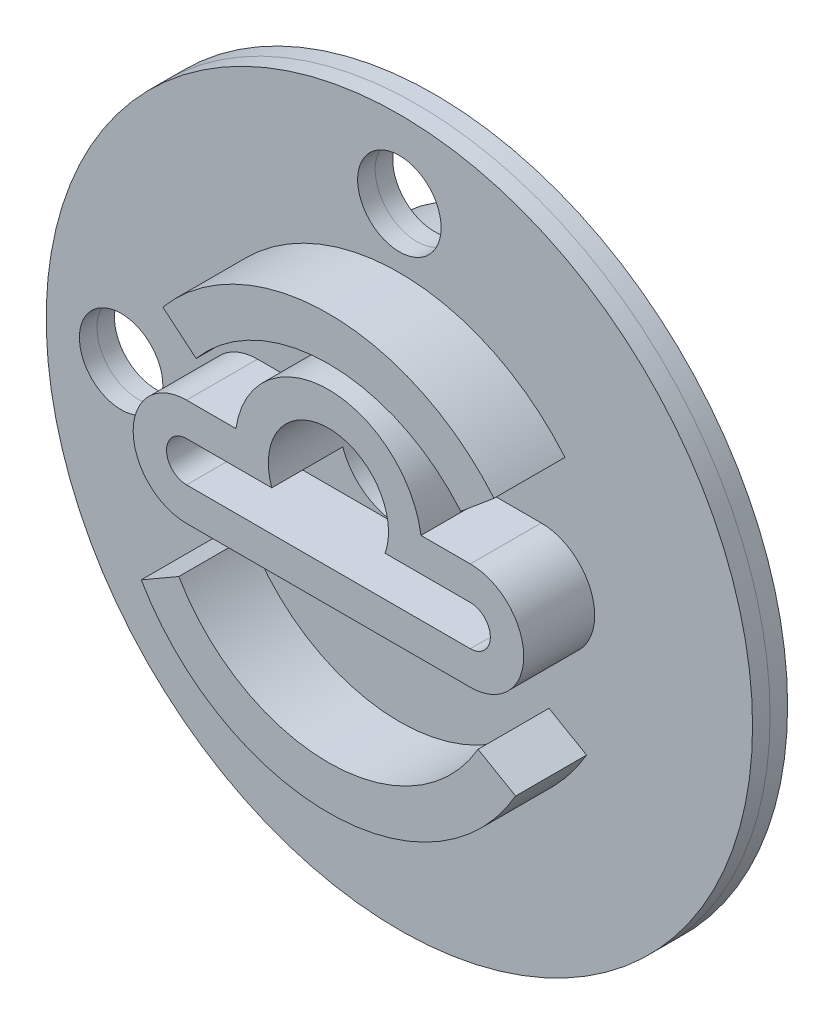
ISO-10303-21;
HEADER;
FILE_DESCRIPTION(('STEP AP214'),'2;1');
FILE_NAME('part.step','',(''),(''),'','','');
FILE_SCHEMA(('AUTOMOTIVE_DESIGN { 1 0 10303 214 1 1 1 1 }'));
ENDSEC;
DATA;
#1=APPLICATION_CONTEXT('core data for automotive mechanical design processes');
#2=APPLICATION_PROTOCOL_DEFINITION('international standard','automotive_design',2000,#1);
#3=PRODUCT_CONTEXT('',#1,'mechanical');
#4=PRODUCT('Part','Part','',(#3));
#5=PRODUCT_RELATED_PRODUCT_CATEGORY('part','',(#4));
#6=PRODUCT_DEFINITION_FORMATION('','',#4);
#7=PRODUCT_DEFINITION_CONTEXT('part definition',#1,'design');
#8=PRODUCT_DEFINITION('design','',#6,#7);
#9=PRODUCT_DEFINITION_SHAPE('','',#8);
#10=(LENGTH_UNIT() NAMED_UNIT(*) SI_UNIT(.MILLI.,.METRE.));
#11=(NAMED_UNIT(*) PLANE_ANGLE_UNIT() SI_UNIT($,.RADIAN.));
#12=(NAMED_UNIT(*) SI_UNIT($,.STERADIAN.) SOLID_ANGLE_UNIT());
#13=UNCERTAINTY_MEASURE_WITH_UNIT(LENGTH_MEASURE(1.E-05),#10,'distance_accuracy_value','');
#14=(GEOMETRIC_REPRESENTATION_CONTEXT(3) GLOBAL_UNCERTAINTY_ASSIGNED_CONTEXT((#13)) GLOBAL_UNIT_ASSIGNED_CONTEXT((#10,
#11,#12)) REPRESENTATION_CONTEXT('',''));
#15=CARTESIAN_POINT('',(0.,0.,0.));
#16=DIRECTION('',(0.,0.,1.));
#17=DIRECTION('',(1.,0.,0.));
#18=AXIS2_PLACEMENT_3D('',#15,#16,#17);
#19=CARTESIAN_POINT('',(-21.17,21.16,1.05));
#20=DIRECTION('',(0.,0.,1.));
#21=DIRECTION('',(1.,0.,0.));
#22=AXIS2_PLACEMENT_3D('',#19,#20,#21);
#23=PLANE('',#22);
#24=CARTESIAN_POINT('',(0.,16.5276106642978,1.05));
#25=DIRECTION('',(0.,0.,1.));
#26=DIRECTION('',(1.,0.,0.));
#27=AXIS2_PLACEMENT_3D('',#24,#25,#26);
#28=CIRCLE('',#27,2.5);
#29=CARTESIAN_POINT('',(2.5,16.5276106642978,1.05));
#30=VERTEX_POINT('',#29);
#31=EDGE_CURVE('E66',#30,#30,#28,.T.);
#32=ORIENTED_EDGE('',*,*,#31,.F.);
#33=EDGE_LOOP('',(#32));
#34=FACE_BOUND('',#33,.T.);
#35=CARTESIAN_POINT('',(-16.6704941141802,0.,1.05));
#36=DIRECTION('',(0.,0.,1.));
#37=DIRECTION('',(1.,0.,0.));
#38=AXIS2_PLACEMENT_3D('',#35,#36,#37);
#39=CIRCLE('',#38,2.5);
#40=CARTESIAN_POINT('',(-14.1704941141802,0.,1.05));
#41=VERTEX_POINT('',#40);
#42=EDGE_CURVE('E69',#41,#41,#39,.T.);
#43=ORIENTED_EDGE('',*,*,#42,.F.);
#44=EDGE_LOOP('',(#43));
#45=FACE_BOUND('',#44,.T.);
#46=CARTESIAN_POINT('',(0.,0.,1.05));
#47=DIRECTION('',(0.,0.,1.));
#48=DIRECTION('',(1.,0.,0.));
#49=AXIS2_PLACEMENT_3D('',#46,#47,#48);
#50=CIRCLE('',#49,21.16);
#51=CARTESIAN_POINT('',(21.16,0.,1.05));
#52=VERTEX_POINT('',#51);
#53=EDGE_CURVE('E60',#52,#52,#50,.T.);
#54=ORIENTED_EDGE('',*,*,#53,.T.);
#55=EDGE_LOOP('',(#54));
#56=FACE_BOUND('',#55,.T.);
#57=CARTESIAN_POINT('',(0.,3.41,1.05));
#58=DIRECTION('',(0.,0.,1.));
#59=DIRECTION('',(1.,0.,0.));
#60=AXIS2_PLACEMENT_3D('',#57,#58,#59);
#61=CIRCLE('',#60,3.6);
#62=CARTESIAN_POINT('',(3.6,3.41,1.05));
#63=VERTEX_POINT('',#62);
#64=EDGE_CURVE('E64',#63,#63,#61,.F.);
#65=ORIENTED_EDGE('',*,*,#64,.T.);
#66=EDGE_LOOP('',(#65));
#67=FACE_BOUND('',#66,.T.);
#68=ADVANCED_FACE('F42',(#34,#45,#56,#67),#23,.T.);
#69=CARTESIAN_POINT('',(0.,0.,2.1));
#70=DIRECTION('',(0.,0.,-1.));
#71=DIRECTION('',(-1.,0.,0.));
#72=AXIS2_PLACEMENT_3D('',#69,#70,#71);
#73=CYLINDRICAL_SURFACE('',#72,21.16);
#74=CARTESIAN_POINT('',(0.,0.,0.));
#75=DIRECTION('',(0.,0.,1.));
#76=DIRECTION('',(1.,0.,0.));
#77=AXIS2_PLACEMENT_3D('',#74,#75,#76);
#78=CIRCLE('',#77,21.16);
#79=CARTESIAN_POINT('',(21.16,0.,0.));
#80=VERTEX_POINT('',#79);
#81=EDGE_CURVE('E85',#80,#80,#78,.T.);
#82=ORIENTED_EDGE('',*,*,#81,.T.);
#83=EDGE_LOOP('',(#82));
#84=FACE_BOUND('',#83,.T.);
#85=ORIENTED_EDGE('',*,*,#53,.F.);
#86=EDGE_LOOP('',(#85));
#87=FACE_BOUND('',#86,.T.);
#88=ADVANCED_FACE('F44',(#84,#87),#73,.T.);
#89=CARTESIAN_POINT('',(0.,3.41,0.));
#90=DIRECTION('',(0.,0.,1.));
#91=DIRECTION('',(1.,0.,0.));
#92=AXIS2_PLACEMENT_3D('',#89,#90,#91);
#93=CYLINDRICAL_SURFACE('',#92,3.6);
#94=CARTESIAN_POINT('',(0.,3.41,-2.2));
#95=DIRECTION('',(0.,0.,-1.));
#96=DIRECTION('',(-1.,0.,0.));
#97=AXIS2_PLACEMENT_3D('',#94,#95,#96);
#98=CIRCLE('',#97,3.6);
#99=CARTESIAN_POINT('',(-3.6,3.41,-2.2));
#100=VERTEX_POINT('',#99);
#101=EDGE_CURVE('E90',#100,#100,#98,.T.);
#102=ORIENTED_EDGE('',*,*,#101,.T.);
#103=EDGE_LOOP('',(#102));
#104=FACE_BOUND('',#103,.T.);
#105=ORIENTED_EDGE('',*,*,#64,.F.);
#106=EDGE_LOOP('',(#105));
#107=FACE_BOUND('',#106,.T.);
#108=ADVANCED_FACE('F118',(#104,#107),#93,.F.);
#109=CARTESIAN_POINT('',(0.,0.,0.));
#110=DIRECTION('',(0.,0.,1.));
#111=DIRECTION('',(1.,0.,0.));
#112=AXIS2_PLACEMENT_3D('',#109,#110,#111);
#113=PLANE('',#112);
#114=CARTESIAN_POINT('',(0.,3.595,0.));
#115=DIRECTION('',(0.,0.,1.));
#116=DIRECTION('',(1.,0.,0.));
#117=AXIS2_PLACEMENT_3D('',#114,#115,#116);
#118=CIRCLE('',#117,4.85);
#119=CARTESIAN_POINT('',(4.85,3.595,0.));
#120=VERTEX_POINT('',#119);
#121=EDGE_CURVE('E82',#120,#120,#118,.F.);
#122=ORIENTED_EDGE('',*,*,#121,.F.);
#123=EDGE_LOOP('',(#122));
#124=FACE_BOUND('',#123,.T.);
#125=CARTESIAN_POINT('',(0.,0.,0.));
#126=DIRECTION('',(0.,0.,-1.));
#127=DIRECTION('',(-1.,0.,0.));
#128=AXIS2_PLACEMENT_3D('',#125,#126,#127);
#129=CIRCLE('',#128,10.);
#130=CARTESIAN_POINT('',(-10.,0.,0.));
#131=VERTEX_POINT('',#130);
#132=EDGE_CURVE('E11',#131,#131,#129,.T.);
#133=ORIENTED_EDGE('',*,*,#132,.T.);
#134=EDGE_LOOP('',(#133));
#135=FACE_BOUND('',#134,.T.);
#136=ADVANCED_FACE('F111',(#124,#135),#113,.F.);
#137=CARTESIAN_POINT('',(0.,16.5276106642978,0.));
#138=DIRECTION('',(0.,0.,1.));
#139=DIRECTION('',(1.,0.,0.));
#140=AXIS2_PLACEMENT_3D('',#137,#138,#139);
#141=CIRCLE('',#140,2.5);
#142=CARTESIAN_POINT('',(2.5,16.5276106642978,0.));
#143=VERTEX_POINT('',#142);
#144=EDGE_CURVE('E46',#143,#143,#141,.T.);
#145=ORIENTED_EDGE('',*,*,#144,.T.);
#146=EDGE_LOOP('',(#145));
#147=FACE_BOUND('',#146,.T.);
#148=CARTESIAN_POINT('',(-16.6704941141802,0.,0.));
#149=DIRECTION('',(0.,0.,1.));
#150=DIRECTION('',(1.,0.,0.));
#151=AXIS2_PLACEMENT_3D('',#148,#149,#150);
#152=CIRCLE('',#151,2.5);
#153=CARTESIAN_POINT('',(-14.1704941141802,0.,0.));
#154=VERTEX_POINT('',#153);
#155=EDGE_CURVE('E67',#154,#154,#152,.T.);
#156=ORIENTED_EDGE('',*,*,#155,.T.);
#157=EDGE_LOOP('',(#156));
#158=FACE_BOUND('',#157,.T.);
#159=CARTESIAN_POINT('',(0.,0.,0.));
#160=DIRECTION('',(0.,0.,1.));
#161=DIRECTION('',(1.,0.,0.));
#162=AXIS2_PLACEMENT_3D('',#159,#160,#161);
#163=CIRCLE('',#162,11.25);
#164=CARTESIAN_POINT('',(11.25,0.,0.));
#165=VERTEX_POINT('',#164);
#166=EDGE_CURVE('E63',#165,#165,#163,.F.);
#167=ORIENTED_EDGE('',*,*,#166,.F.);
#168=EDGE_LOOP('',(#167));
#169=FACE_BOUND('',#168,.T.);
#170=ORIENTED_EDGE('',*,*,#81,.F.);
#171=EDGE_LOOP('',(#170));
#172=FACE_BOUND('',#171,.T.);
#173=ADVANCED_FACE('F107',(#147,#158,#169,#172),#113,.F.);
#174=CARTESIAN_POINT('',(0.,3.595,-2.2));
#175=DIRECTION('',(0.,0.,-1.));
#176=DIRECTION('',(-1.,0.,0.));
#177=AXIS2_PLACEMENT_3D('',#174,#175,#176);
#178=PLANE('',#177);
#179=CARTESIAN_POINT('',(0.,3.595,-2.2));
#180=DIRECTION('',(0.,0.,-1.));
#181=DIRECTION('',(-1.,0.,0.));
#182=AXIS2_PLACEMENT_3D('',#179,#180,#181);
#183=CIRCLE('',#182,4.85);
#184=CARTESIAN_POINT('',(-4.85,3.595,-2.2));
#185=VERTEX_POINT('',#184);
#186=EDGE_CURVE('E88',#185,#185,#183,.T.);
#187=ORIENTED_EDGE('',*,*,#186,.T.);
#188=EDGE_LOOP('',(#187));
#189=FACE_BOUND('',#188,.T.);
#190=ORIENTED_EDGE('',*,*,#101,.F.);
#191=EDGE_LOOP('',(#190));
#192=FACE_BOUND('',#191,.T.);
#193=ADVANCED_FACE('F110',(#189,#192),#178,.T.);
#194=CARTESIAN_POINT('',(0.,3.595,-2.2));
#195=DIRECTION('',(0.,0.,1.));
#196=DIRECTION('',(1.,0.,0.));
#197=AXIS2_PLACEMENT_3D('',#194,#195,#196);
#198=CYLINDRICAL_SURFACE('',#197,4.85);
#199=ORIENTED_EDGE('',*,*,#186,.F.);
#200=EDGE_LOOP('',(#199));
#201=FACE_BOUND('',#200,.T.);
#202=ORIENTED_EDGE('',*,*,#121,.T.);
#203=EDGE_LOOP('',(#202));
#204=FACE_BOUND('',#203,.T.);
#205=ADVANCED_FACE('F138',(#201,#204),#198,.T.);
#206=CARTESIAN_POINT('',(0.,0.,-6.));
#207=DIRECTION('',(0.,0.,-1.));
#208=DIRECTION('',(-1.,0.,0.));
#209=AXIS2_PLACEMENT_3D('',#206,#207,#208);
#210=PLANE('',#209);
#211=CARTESIAN_POINT('',(0.,0.,-6.));
#212=DIRECTION('',(0.,0.,-1.));
#213=DIRECTION('',(-1.,0.,0.));
#214=AXIS2_PLACEMENT_3D('',#211,#212,#213);
#215=CIRCLE('',#214,11.25);
#216=CARTESIAN_POINT('',(-11.25,0.,-6.));
#217=VERTEX_POINT('',#216);
#218=EDGE_CURVE('E55',#217,#217,#215,.T.);
#219=ORIENTED_EDGE('',*,*,#218,.T.);
#220=EDGE_LOOP('',(#219));
#221=FACE_BOUND('',#220,.T.);
#222=CARTESIAN_POINT('',(0.,0.,-6.));
#223=DIRECTION('',(0.,0.,-1.));
#224=DIRECTION('',(-1.,0.,0.));
#225=AXIS2_PLACEMENT_3D('',#222,#223,#224);
#226=CIRCLE('',#225,10.);
#227=CARTESIAN_POINT('',(-10.,0.,-6.));
#228=VERTEX_POINT('',#227);
#229=EDGE_CURVE('E50',#228,#228,#226,.T.);
#230=ORIENTED_EDGE('',*,*,#229,.F.);
#231=EDGE_LOOP('',(#230));
#232=FACE_BOUND('',#231,.T.);
#233=ADVANCED_FACE('F97',(#221,#232),#210,.T.);
#234=CARTESIAN_POINT('',(0.,0.,-6.));
#235=DIRECTION('',(0.,0.,1.));
#236=DIRECTION('',(1.,0.,0.));
#237=AXIS2_PLACEMENT_3D('',#234,#235,#236);
#238=CYLINDRICAL_SURFACE('',#237,11.25);
#239=ORIENTED_EDGE('',*,*,#218,.F.);
#240=EDGE_LOOP('',(#239));
#241=FACE_BOUND('',#240,.T.);
#242=ORIENTED_EDGE('',*,*,#166,.T.);
#243=EDGE_LOOP('',(#242));
#244=FACE_BOUND('',#243,.T.);
#245=ADVANCED_FACE('F100',(#241,#244),#238,.T.);
#246=CARTESIAN_POINT('',(0.,0.,-6.));
#247=DIRECTION('',(0.,0.,1.));
#248=DIRECTION('',(1.,0.,0.));
#249=AXIS2_PLACEMENT_3D('',#246,#247,#248);
#250=CYLINDRICAL_SURFACE('',#249,10.);
#251=ORIENTED_EDGE('',*,*,#229,.T.);
#252=EDGE_LOOP('',(#251));
#253=FACE_BOUND('',#252,.T.);
#254=ORIENTED_EDGE('',*,*,#132,.F.);
#255=EDGE_LOOP('',(#254));
#256=FACE_BOUND('',#255,.T.);
#257=ADVANCED_FACE('F103',(#253,#256),#250,.F.);
#258=CARTESIAN_POINT('',(-16.6704941141802,0.,-6.));
#259=DIRECTION('',(0.,0.,1.));
#260=DIRECTION('',(1.,0.,0.));
#261=AXIS2_PLACEMENT_3D('',#258,#259,#260);
#262=CYLINDRICAL_SURFACE('',#261,2.5);
#263=ORIENTED_EDGE('',*,*,#42,.T.);
#264=EDGE_LOOP('',(#263));
#265=FACE_BOUND('',#264,.T.);
#266=ORIENTED_EDGE('',*,*,#155,.F.);
#267=EDGE_LOOP('',(#266));
#268=FACE_BOUND('',#267,.T.);
#269=ADVANCED_FACE('F125',(#265,#268),#262,.F.);
#270=CARTESIAN_POINT('',(0.,16.5276106642978,-6.));
#271=DIRECTION('',(0.,0.,1.));
#272=DIRECTION('',(1.,0.,0.));
#273=AXIS2_PLACEMENT_3D('',#270,#271,#272);
#274=CYLINDRICAL_SURFACE('',#273,2.5);
#275=ORIENTED_EDGE('',*,*,#31,.T.);
#276=EDGE_LOOP('',(#275));
#277=FACE_BOUND('',#276,.T.);
#278=ORIENTED_EDGE('',*,*,#144,.F.);
#279=EDGE_LOOP('',(#278));
#280=FACE_BOUND('',#279,.T.);
#281=ADVANCED_FACE('F148',(#277,#280),#274,.F.);
#282=CLOSED_SHELL('',(#68,#88,#108,#136,#173,#193,#205,#233,#245,#257,#269,#281));
#283=MANIFOLD_SOLID_BREP('B2',#282);
#284=CARTESIAN_POINT('',(0.,0.,2.1));
#285=DIRECTION('',(0.,0.,1.));
#286=DIRECTION('',(1.,0.,0.));
#287=AXIS2_PLACEMENT_3D('',#284,#285,#286);
#288=PLANE('',#287);
#289=CARTESIAN_POINT('',(0.,16.5276106642978,2.1));
#290=DIRECTION('',(0.,0.,1.));
#291=DIRECTION('',(1.,0.,0.));
#292=AXIS2_PLACEMENT_3D('',#289,#290,#291);
#293=CIRCLE('',#292,2.5);
#294=CARTESIAN_POINT('',(2.5,16.5276106642978,2.1));
#295=VERTEX_POINT('',#294);
#296=EDGE_CURVE('E538',#295,#295,#293,.T.);
#297=ORIENTED_EDGE('',*,*,#296,.F.);
#298=EDGE_LOOP('',(#297));
#299=FACE_BOUND('',#298,.T.);
#300=CARTESIAN_POINT('',(-16.6704941141802,0.,2.1));
#301=DIRECTION('',(0.,0.,1.));
#302=DIRECTION('',(1.,0.,0.));
#303=AXIS2_PLACEMENT_3D('',#300,#301,#302);
#304=CIRCLE('',#303,2.5);
#305=CARTESIAN_POINT('',(-14.1704941141802,0.,2.1));
#306=VERTEX_POINT('',#305);
#307=EDGE_CURVE('E543',#306,#306,#304,.T.);
#308=ORIENTED_EDGE('',*,*,#307,.F.);
#309=EDGE_LOOP('',(#308));
#310=FACE_BOUND('',#309,.T.);
#311=CARTESIAN_POINT('',(-8.49999999999999,1.01,2.1));
#312=DIRECTION('',(0.,0.,1.));
#313=DIRECTION('',(1.,0.,0.));
#314=AXIS2_PLACEMENT_3D('',#311,#312,#313);
#315=CIRCLE('',#314,3.2);
#316=CARTESIAN_POINT('',(-8.49999999999999,4.21,2.1));
#317=VERTEX_POINT('',#316);
#318=CARTESIAN_POINT('',(-8.49999999999999,-2.19,2.1));
#319=VERTEX_POINT('',#318);
#320=EDGE_CURVE('E476',#317,#319,#315,.T.);
#321=ORIENTED_EDGE('',*,*,#320,.F.);
#322=DIRECTION('',(-1.,0.,0.));
#323=VECTOR('',#322,1.);
#324=CARTESIAN_POINT('',(-8.49999999999999,4.21,2.1));
#325=LINE('',#324,#323);
#326=CARTESIAN_POINT('',(-5.5425625842204,4.21,2.1));
#327=VERTEX_POINT('',#326);
#328=EDGE_CURVE('E481',#327,#317,#325,.T.);
#329=ORIENTED_EDGE('',*,*,#328,.F.);
#330=CARTESIAN_POINT('',(0.,3.41,2.1));
#331=DIRECTION('',(0.,0.,1.));
#332=DIRECTION('',(1.,0.,0.));
#333=AXIS2_PLACEMENT_3D('',#330,#331,#332);
#334=CIRCLE('',#333,5.6);
#335=CARTESIAN_POINT('',(5.5425625842204,4.21000000000009,2.1));
#336=VERTEX_POINT('',#335);
#337=EDGE_CURVE('E503',#336,#327,#334,.T.);
#338=ORIENTED_EDGE('',*,*,#337,.F.);
#339=DIRECTION('',(-1.,0.,0.));
#340=VECTOR('',#339,1.);
#341=CARTESIAN_POINT('',(5.5425625842204,4.21000000000009,2.1));
#342=LINE('',#341,#340);
#343=CARTESIAN_POINT('',(8.5,4.21,2.1));
#344=VERTEX_POINT('',#343);
#345=EDGE_CURVE('E500',#344,#336,#342,.T.);
#346=ORIENTED_EDGE('',*,*,#345,.F.);
#347=CARTESIAN_POINT('',(8.5,1.01,2.1));
#348=DIRECTION('',(0.,0.,1.));
#349=DIRECTION('',(1.,0.,0.));
#350=AXIS2_PLACEMENT_3D('',#347,#348,#349);
#351=CIRCLE('',#350,3.2);
#352=CARTESIAN_POINT('',(8.5,-2.19,2.1));
#353=VERTEX_POINT('',#352);
#354=EDGE_CURVE('E497',#353,#344,#351,.T.);
#355=ORIENTED_EDGE('',*,*,#354,.F.);
#356=DIRECTION('',(1.,0.,0.));
#357=VECTOR('',#356,1.);
#358=CARTESIAN_POINT('',(-8.49999999999999,-2.19,2.1));
#359=LINE('',#358,#357);
#360=EDGE_CURVE('E494',#319,#353,#359,.T.);
#361=ORIENTED_EDGE('',*,*,#360,.F.);
#362=EDGE_LOOP('',(#321,#329,#338,#346,#355,#361));
#363=FACE_BOUND('',#362,.T.);
#364=CARTESIAN_POINT('',(0.,0.,2.1));
#365=DIRECTION('',(0.,0.,1.));
#366=DIRECTION('',(1.,0.,0.));
#367=AXIS2_PLACEMENT_3D('',#364,#365,#366);
#368=CIRCLE('',#367,21.16);
#369=CARTESIAN_POINT('',(21.16,0.,2.1));
#370=VERTEX_POINT('',#369);
#371=EDGE_CURVE('E529',#370,#370,#368,.T.);
#372=ORIENTED_EDGE('',*,*,#371,.T.);
#373=EDGE_LOOP('',(#372));
#374=FACE_BOUND('',#373,.T.);
#375=DIRECTION('',(-0.866025403784436,-0.500000000000004,0.));
#376=VECTOR('',#375,1.);
#377=CARTESIAN_POINT('',(-8.96336292916891,-5.17500000000004,2.1));
#378=LINE('',#377,#376);
#379=CARTESIAN_POINT('',(-8.96336292916891,-5.17500000000004,2.1));
#380=VERTEX_POINT('',#379);
#381=CARTESIAN_POINT('',(-11.2150289790085,-6.47500000000005,2.1));
#382=VERTEX_POINT('',#381);
#383=EDGE_CURVE('E409',#380,#382,#378,.T.);
#384=ORIENTED_EDGE('',*,*,#383,.F.);
#385=CARTESIAN_POINT('',(0.,0.,2.1));
#386=DIRECTION('',(0.,0.,-1.));
#387=DIRECTION('',(1.,0.,0.));
#388=AXIS2_PLACEMENT_3D('',#385,#386,#387);
#389=CIRCLE('',#388,10.35);
#390=CARTESIAN_POINT('',(8.96336292916899,-5.17499999999991,2.1));
#391=VERTEX_POINT('',#390);
#392=EDGE_CURVE('E406',#391,#380,#389,.T.);
#393=ORIENTED_EDGE('',*,*,#392,.F.);
#394=DIRECTION('',(-0.866025403784444,0.499999999999992,0.));
#395=VECTOR('',#394,1.);
#396=CARTESIAN_POINT('',(8.96336292916899,-5.17499999999991,2.1));
#397=LINE('',#396,#395);
#398=CARTESIAN_POINT('',(11.2150289790085,-6.47499999999989,2.1));
#399=VERTEX_POINT('',#398);
#400=EDGE_CURVE('E418',#399,#391,#397,.T.);
#401=ORIENTED_EDGE('',*,*,#400,.F.);
#402=CARTESIAN_POINT('',(0.,0.,2.1));
#403=DIRECTION('',(0.,0.,1.));
#404=DIRECTION('',(1.,0.,0.));
#405=AXIS2_PLACEMENT_3D('',#402,#403,#404);
#406=CIRCLE('',#405,12.95);
#407=EDGE_CURVE('E426',#382,#399,#406,.T.);
#408=ORIENTED_EDGE('',*,*,#407,.F.);
#409=EDGE_LOOP('',(#384,#393,#401,#408));
#410=FACE_BOUND('',#409,.T.);
#411=DIRECTION('',(0.766044443118979,0.642787609686538,0.));
#412=VECTOR('',#411,1.);
#413=CARTESIAN_POINT('',(7.92855998628144,6.65285176025567,2.1));
#414=LINE('',#413,#412);
#415=CARTESIAN_POINT('',(7.92855998628144,6.65285176025567,2.1));
#416=VERTEX_POINT('',#415);
#417=CARTESIAN_POINT('',(9.92027553839078,8.32409954544067,2.1));
#418=VERTEX_POINT('',#417);
#419=EDGE_CURVE('E554',#416,#418,#414,.T.);
#420=ORIENTED_EDGE('',*,*,#419,.F.);
#421=CARTESIAN_POINT('',(0.,0.,2.1));
#422=DIRECTION('',(0.,0.,-1.));
#423=DIRECTION('',(1.,0.,0.));
#424=AXIS2_PLACEMENT_3D('',#421,#422,#423);
#425=CIRCLE('',#424,10.35);
#426=CARTESIAN_POINT('',(-7.92855998628143,6.65285176025567,2.1));
#427=VERTEX_POINT('',#426);
#428=EDGE_CURVE('E404',#427,#416,#425,.T.);
#429=ORIENTED_EDGE('',*,*,#428,.F.);
#430=DIRECTION('',(0.766044443118979,-0.642787609686538,0.));
#431=VECTOR('',#430,1.);
#432=CARTESIAN_POINT('',(-7.92855998628143,6.65285176025567,2.1));
#433=LINE('',#432,#431);
#434=CARTESIAN_POINT('',(-9.92027553839078,8.32409954544067,2.1));
#435=VERTEX_POINT('',#434);
#436=EDGE_CURVE('E400',#435,#427,#433,.T.);
#437=ORIENTED_EDGE('',*,*,#436,.F.);
#438=CARTESIAN_POINT('',(0.,0.,2.1));
#439=DIRECTION('',(0.,0.,1.));
#440=DIRECTION('',(1.,0.,0.));
#441=AXIS2_PLACEMENT_3D('',#438,#439,#440);
#442=CIRCLE('',#441,12.95);
#443=EDGE_CURVE('E556',#418,#435,#442,.T.);
#444=ORIENTED_EDGE('',*,*,#443,.F.);
#445=EDGE_LOOP('',(#420,#429,#437,#444));
#446=FACE_BOUND('',#445,.T.);
#447=ADVANCED_FACE('F237',(#299,#310,#363,#374,#410,#446),#288,.T.);
#448=CARTESIAN_POINT('',(8.5,1.01,2.1));
#449=DIRECTION('',(0.,0.,1.));
#450=DIRECTION('',(1.,0.,0.));
#451=AXIS2_PLACEMENT_3D('',#448,#449,#450);
#452=CIRCLE('',#451,1.2);
#453=CARTESIAN_POINT('',(8.5,-0.189999999999997,2.1));
#454=VERTEX_POINT('',#453);
#455=CARTESIAN_POINT('',(8.5,2.21,2.1));
#456=VERTEX_POINT('',#455);
#457=EDGE_CURVE('E456',#454,#456,#452,.T.);
#458=ORIENTED_EDGE('',*,*,#457,.T.);
#459=DIRECTION('',(-1.,0.,0.));
#460=VECTOR('',#459,1.);
#461=CARTESIAN_POINT('',(3.39411254969543,2.21,2.1));
#462=LINE('',#461,#460);
#463=CARTESIAN_POINT('',(3.39411254969543,2.21,2.1));
#464=VERTEX_POINT('',#463);
#465=EDGE_CURVE('E459',#456,#464,#462,.T.);
#466=ORIENTED_EDGE('',*,*,#465,.T.);
#467=CARTESIAN_POINT('',(0.,3.41,2.1));
#468=DIRECTION('',(0.,0.,1.));
#469=DIRECTION('',(1.,0.,0.));
#470=AXIS2_PLACEMENT_3D('',#467,#468,#469);
#471=CIRCLE('',#470,3.6);
#472=CARTESIAN_POINT('',(0.,-0.189999999999998,2.1));
#473=VERTEX_POINT('',#472);
#474=EDGE_CURVE('E525',#473,#464,#471,.T.);
#475=ORIENTED_EDGE('',*,*,#474,.F.);
#476=DIRECTION('',(1.,0.,0.));
#477=VECTOR('',#476,1.);
#478=CARTESIAN_POINT('',(-8.49999999999999,-0.189999999999999,2.1));
#479=LINE('',#478,#477);
#480=EDGE_CURVE('E40',#473,#454,#479,.T.);
#481=ORIENTED_EDGE('',*,*,#480,.T.);
#482=EDGE_LOOP('',(#458,#466,#475,#481));
#483=FACE_BOUND('',#482,.T.);
#484=ADVANCED_FACE('F575',(#483),#288,.T.);
#485=CARTESIAN_POINT('',(-8.49999999999999,1.01,2.1));
#486=DIRECTION('',(0.,0.,1.));
#487=DIRECTION('',(1.,0.,0.));
#488=AXIS2_PLACEMENT_3D('',#485,#486,#487);
#489=CIRCLE('',#488,1.2);
#490=CARTESIAN_POINT('',(-8.49999999999999,2.21,2.1));
#491=VERTEX_POINT('',#490);
#492=CARTESIAN_POINT('',(-8.49999999999999,-0.189999999999999,2.1));
#493=VERTEX_POINT('',#492);
#494=EDGE_CURVE('E437',#491,#493,#489,.T.);
#495=ORIENTED_EDGE('',*,*,#494,.T.);
#496=EDGE_CURVE('E248',#493,#473,#479,.T.);
#497=ORIENTED_EDGE('',*,*,#496,.T.);
#498=CARTESIAN_POINT('',(-3.39411254969543,2.21,2.1));
#499=VERTEX_POINT('',#498);
#500=EDGE_CURVE('E526',#499,#473,#471,.T.);
#501=ORIENTED_EDGE('',*,*,#500,.F.);
#502=DIRECTION('',(-1.,0.,0.));
#503=VECTOR('',#502,1.);
#504=CARTESIAN_POINT('',(-8.49999999999999,2.21,2.1));
#505=LINE('',#504,#503);
#506=EDGE_CURVE('E441',#499,#491,#505,.T.);
#507=ORIENTED_EDGE('',*,*,#506,.T.);
#508=EDGE_LOOP('',(#495,#497,#501,#507));
#509=FACE_BOUND('',#508,.T.);
#510=ADVANCED_FACE('F578',(#509),#288,.T.);
#511=CARTESIAN_POINT('',(-21.17,21.16,1.05));
#512=DIRECTION('',(0.,0.,1.));
#513=DIRECTION('',(1.,0.,0.));
#514=AXIS2_PLACEMENT_3D('',#511,#512,#513);
#515=PLANE('',#514);
#516=CARTESIAN_POINT('',(0.,16.5276106642978,1.05));
#517=DIRECTION('',(0.,0.,1.));
#518=DIRECTION('',(1.,0.,0.));
#519=AXIS2_PLACEMENT_3D('',#516,#517,#518);
#520=CIRCLE('',#519,2.5);
#521=CARTESIAN_POINT('',(2.5,16.5276106642978,1.05));
#522=VERTEX_POINT('',#521);
#523=EDGE_CURVE('E241',#522,#522,#520,.T.);
#524=ORIENTED_EDGE('',*,*,#523,.T.);
#525=EDGE_LOOP('',(#524));
#526=FACE_BOUND('',#525,.T.);
#527=CARTESIAN_POINT('',(-16.6704941141802,0.,1.05));
#528=DIRECTION('',(0.,0.,1.));
#529=DIRECTION('',(1.,0.,0.));
#530=AXIS2_PLACEMENT_3D('',#527,#528,#529);
#531=CIRCLE('',#530,2.5);
#532=CARTESIAN_POINT('',(-14.1704941141802,0.,1.05));
#533=VERTEX_POINT('',#532);
#534=EDGE_CURVE('E536',#533,#533,#531,.T.);
#535=ORIENTED_EDGE('',*,*,#534,.T.);
#536=EDGE_LOOP('',(#535));
#537=FACE_BOUND('',#536,.T.);
#538=CARTESIAN_POINT('',(0.,3.41,1.05));
#539=DIRECTION('',(0.,0.,1.));
#540=DIRECTION('',(1.,0.,0.));
#541=AXIS2_PLACEMENT_3D('',#538,#539,#540);
#542=CIRCLE('',#541,3.6);
#543=CARTESIAN_POINT('',(3.6,3.41,1.05));
#544=VERTEX_POINT('',#543);
#545=EDGE_CURVE('E532',#544,#544,#542,.F.);
#546=ORIENTED_EDGE('',*,*,#545,.F.);
#547=EDGE_LOOP('',(#546));
#548=FACE_BOUND('',#547,.T.);
#549=CARTESIAN_POINT('',(0.,0.,1.05));
#550=DIRECTION('',(0.,0.,1.));
#551=DIRECTION('',(1.,0.,0.));
#552=AXIS2_PLACEMENT_3D('',#549,#550,#551);
#553=CIRCLE('',#552,21.16);
#554=CARTESIAN_POINT('',(21.16,0.,1.05));
#555=VERTEX_POINT('',#554);
#556=EDGE_CURVE('E246',#555,#555,#553,.T.);
#557=ORIENTED_EDGE('',*,*,#556,.F.);
#558=EDGE_LOOP('',(#557));
#559=FACE_BOUND('',#558,.T.);
#560=ADVANCED_FACE('F239',(#526,#537,#548,#559),#515,.F.);
#561=CARTESIAN_POINT('',(0.,3.41,0.));
#562=DIRECTION('',(0.,0.,1.));
#563=DIRECTION('',(1.,0.,0.));
#564=AXIS2_PLACEMENT_3D('',#561,#562,#563);
#565=CYLINDRICAL_SURFACE('',#564,3.6);
#566=ORIENTED_EDGE('',*,*,#545,.T.);
#567=EDGE_LOOP('',(#566));
#568=FACE_BOUND('',#567,.T.);
#569=ORIENTED_EDGE('',*,*,#500,.T.);
#570=ORIENTED_EDGE('',*,*,#474,.T.);
#571=DIRECTION('',(0.,0.,-1.));
#572=VECTOR('',#571,1.);
#573=CARTESIAN_POINT('',(3.39411254969543,2.21,6.35));
#574=LINE('',#573,#572);
#575=CARTESIAN_POINT('',(3.39411254969543,2.21,6.35));
#576=VERTEX_POINT('',#575);
#577=EDGE_CURVE('E467',#576,#464,#574,.T.);
#578=ORIENTED_EDGE('',*,*,#577,.F.);
#579=CARTESIAN_POINT('',(0.,3.41,6.35));
#580=DIRECTION('',(0.,0.,1.));
#581=DIRECTION('',(1.,0.,0.));
#582=AXIS2_PLACEMENT_3D('',#579,#580,#581);
#583=CIRCLE('',#582,3.6);
#584=CARTESIAN_POINT('',(-3.39411254969543,2.21,6.35));
#585=VERTEX_POINT('',#584);
#586=EDGE_CURVE('E447',#576,#585,#583,.T.);
#587=ORIENTED_EDGE('',*,*,#586,.T.);
#588=DIRECTION('',(0.,0.,-1.));
#589=VECTOR('',#588,1.);
#590=CARTESIAN_POINT('',(-3.39411254969543,2.21,6.35));
#591=LINE('',#590,#589);
#592=EDGE_CURVE('E465',#585,#499,#591,.T.);
#593=ORIENTED_EDGE('',*,*,#592,.T.);
#594=EDGE_LOOP('',(#569,#570,#578,#587,#593));
#595=FACE_BOUND('',#594,.T.);
#596=ADVANCED_FACE('F590',(#568,#595),#565,.F.);
#597=CARTESIAN_POINT('',(0.,0.,2.1));
#598=DIRECTION('',(0.,0.,-1.));
#599=DIRECTION('',(-1.,0.,0.));
#600=AXIS2_PLACEMENT_3D('',#597,#598,#599);
#601=CYLINDRICAL_SURFACE('',#600,21.16);
#602=ORIENTED_EDGE('',*,*,#556,.T.);
#603=EDGE_LOOP('',(#602));
#604=FACE_BOUND('',#603,.T.);
#605=ORIENTED_EDGE('',*,*,#371,.F.);
#606=EDGE_LOOP('',(#605));
#607=FACE_BOUND('',#606,.T.);
#608=ADVANCED_FACE('F592',(#604,#607),#601,.T.);
#609=CARTESIAN_POINT('',(-8.49999999999999,1.01,6.35));
#610=DIRECTION('',(0.,0.,1.));
#611=DIRECTION('',(1.,0.,0.));
#612=AXIS2_PLACEMENT_3D('',#609,#610,#611);
#613=PLANE('',#612);
#614=CARTESIAN_POINT('',(-8.49999999999999,1.01,6.35));
#615=DIRECTION('',(0.,0.,1.));
#616=DIRECTION('',(1.,0.,0.));
#617=AXIS2_PLACEMENT_3D('',#614,#615,#616);
#618=CIRCLE('',#617,3.2);
#619=CARTESIAN_POINT('',(-8.49999999999999,4.21,6.35));
#620=VERTEX_POINT('',#619);
#621=CARTESIAN_POINT('',(-8.49999999999999,-2.19,6.35));
#622=VERTEX_POINT('',#621);
#623=EDGE_CURVE('E477',#620,#622,#618,.T.);
#624=ORIENTED_EDGE('',*,*,#623,.T.);
#625=DIRECTION('',(1.,0.,0.));
#626=VECTOR('',#625,1.);
#627=CARTESIAN_POINT('',(-8.49999999999999,-2.19,6.35));
#628=LINE('',#627,#626);
#629=CARTESIAN_POINT('',(8.5,-2.19,6.35));
#630=VERTEX_POINT('',#629);
#631=EDGE_CURVE('E480',#622,#630,#628,.T.);
#632=ORIENTED_EDGE('',*,*,#631,.T.);
#633=CARTESIAN_POINT('',(8.5,1.01,6.35));
#634=DIRECTION('',(0.,0.,1.));
#635=DIRECTION('',(1.,0.,0.));
#636=AXIS2_PLACEMENT_3D('',#633,#634,#635);
#637=CIRCLE('',#636,3.2);
#638=CARTESIAN_POINT('',(8.5,4.21,6.35));
#639=VERTEX_POINT('',#638);
#640=EDGE_CURVE('E483',#630,#639,#637,.T.);
#641=ORIENTED_EDGE('',*,*,#640,.T.);
#642=DIRECTION('',(-1.,0.,0.));
#643=VECTOR('',#642,1.);
#644=CARTESIAN_POINT('',(5.5425625842204,4.21000000000009,6.35));
#645=LINE('',#644,#643);
#646=CARTESIAN_POINT('',(5.5425625842204,4.21000000000009,6.35));
#647=VERTEX_POINT('',#646);
#648=EDGE_CURVE('E485',#639,#647,#645,.T.);
#649=ORIENTED_EDGE('',*,*,#648,.T.);
#650=CARTESIAN_POINT('',(0.,3.41,6.35));
#651=DIRECTION('',(0.,0.,1.));
#652=DIRECTION('',(1.,0.,0.));
#653=AXIS2_PLACEMENT_3D('',#650,#651,#652);
#654=CIRCLE('',#653,5.6);
#655=CARTESIAN_POINT('',(-5.5425625842204,4.21,6.35));
#656=VERTEX_POINT('',#655);
#657=EDGE_CURVE('E487',#647,#656,#654,.T.);
#658=ORIENTED_EDGE('',*,*,#657,.T.);
#659=DIRECTION('',(-1.,0.,0.));
#660=VECTOR('',#659,1.);
#661=CARTESIAN_POINT('',(-8.49999999999999,4.21,6.35));
#662=LINE('',#661,#660);
#663=EDGE_CURVE('E489',#656,#620,#662,.T.);
#664=ORIENTED_EDGE('',*,*,#663,.T.);
#665=EDGE_LOOP('',(#624,#632,#641,#649,#658,#664));
#666=FACE_BOUND('',#665,.T.);
#667=DIRECTION('',(1.,0.,0.));
#668=VECTOR('',#667,1.);
#669=CARTESIAN_POINT('',(-8.49999999999999,-0.189999999999999,6.35));
#670=LINE('',#669,#668);
#671=CARTESIAN_POINT('',(-8.49999999999999,-0.189999999999999,6.35));
#672=VERTEX_POINT('',#671);
#673=CARTESIAN_POINT('',(8.5,-0.189999999999997,6.35));
#674=VERTEX_POINT('',#673);
#675=EDGE_CURVE('E440',#672,#674,#670,.T.);
#676=ORIENTED_EDGE('',*,*,#675,.F.);
#677=CARTESIAN_POINT('',(-8.49999999999999,1.01,6.35));
#678=DIRECTION('',(0.,0.,1.));
#679=DIRECTION('',(1.,0.,0.));
#680=AXIS2_PLACEMENT_3D('',#677,#678,#679);
#681=CIRCLE('',#680,1.2);
#682=CARTESIAN_POINT('',(-8.49999999999999,2.21,6.35));
#683=VERTEX_POINT('',#682);
#684=EDGE_CURVE('E438',#683,#672,#681,.T.);
#685=ORIENTED_EDGE('',*,*,#684,.F.);
#686=DIRECTION('',(-1.,0.,0.));
#687=VECTOR('',#686,1.);
#688=CARTESIAN_POINT('',(-8.49999999999999,2.21,6.35));
#689=LINE('',#688,#687);
#690=EDGE_CURVE('E450',#585,#683,#689,.T.);
#691=ORIENTED_EDGE('',*,*,#690,.F.);
#692=ORIENTED_EDGE('',*,*,#586,.F.);
#693=DIRECTION('',(-1.,0.,0.));
#694=VECTOR('',#693,1.);
#695=CARTESIAN_POINT('',(3.39411254969543,2.21,6.35));
#696=LINE('',#695,#694);
#697=CARTESIAN_POINT('',(8.5,2.21,6.35));
#698=VERTEX_POINT('',#697);
#699=EDGE_CURVE('E445',#698,#576,#696,.T.);
#700=ORIENTED_EDGE('',*,*,#699,.F.);
#701=CARTESIAN_POINT('',(8.5,1.01,6.35));
#702=DIRECTION('',(0.,0.,1.));
#703=DIRECTION('',(1.,0.,0.));
#704=AXIS2_PLACEMENT_3D('',#701,#702,#703);
#705=CIRCLE('',#704,1.2);
#706=EDGE_CURVE('E443',#674,#698,#705,.T.);
#707=ORIENTED_EDGE('',*,*,#706,.F.);
#708=EDGE_LOOP('',(#676,#685,#691,#692,#700,#707));
#709=FACE_BOUND('',#708,.T.);
#710=ADVANCED_FACE('F608',(#666,#709),#613,.T.);
#711=CARTESIAN_POINT('',(-8.49999999999999,1.01,6.35));
#712=DIRECTION('',(0.,0.,-1.));
#713=DIRECTION('',(-1.,0.,0.));
#714=AXIS2_PLACEMENT_3D('',#711,#712,#713);
#715=CYLINDRICAL_SURFACE('',#714,3.2);
#716=ORIENTED_EDGE('',*,*,#320,.T.);
#717=DIRECTION('',(0.,0.,-1.));
#718=VECTOR('',#717,1.);
#719=CARTESIAN_POINT('',(-8.49999999999999,-2.19,6.35));
#720=LINE('',#719,#718);
#721=EDGE_CURVE('E522',#622,#319,#720,.T.);
#722=ORIENTED_EDGE('',*,*,#721,.F.);
#723=ORIENTED_EDGE('',*,*,#623,.F.);
#724=DIRECTION('',(0.,0.,-1.));
#725=VECTOR('',#724,1.);
#726=CARTESIAN_POINT('',(-8.49999999999999,4.21,6.35));
#727=LINE('',#726,#725);
#728=EDGE_CURVE('E491',#620,#317,#727,.T.);
#729=ORIENTED_EDGE('',*,*,#728,.T.);
#730=EDGE_LOOP('',(#716,#722,#723,#729));
#731=FACE_BOUND('',#730,.T.);
#732=ADVANCED_FACE('F646',(#731),#715,.T.);
#733=CARTESIAN_POINT('',(-8.49999999999999,-2.19,6.35));
#734=DIRECTION('',(0.,1.,0.));
#735=DIRECTION('',(-1.,0.,0.));
#736=AXIS2_PLACEMENT_3D('',#733,#734,#735);
#737=PLANE('',#736);
#738=ORIENTED_EDGE('',*,*,#360,.T.);
#739=DIRECTION('',(0.,0.,-1.));
#740=VECTOR('',#739,1.);
#741=CARTESIAN_POINT('',(8.5,-2.19,6.35));
#742=LINE('',#741,#740);
#743=EDGE_CURVE('E519',#630,#353,#742,.T.);
#744=ORIENTED_EDGE('',*,*,#743,.F.);
#745=ORIENTED_EDGE('',*,*,#631,.F.);
#746=ORIENTED_EDGE('',*,*,#721,.T.);
#747=EDGE_LOOP('',(#738,#744,#745,#746));
#748=FACE_BOUND('',#747,.T.);
#749=ADVANCED_FACE('F662',(#748),#737,.F.);
#750=CARTESIAN_POINT('',(8.5,1.01,6.35));
#751=DIRECTION('',(0.,0.,-1.));
#752=DIRECTION('',(-1.,0.,0.));
#753=AXIS2_PLACEMENT_3D('',#750,#751,#752);
#754=CYLINDRICAL_SURFACE('',#753,3.2);
#755=ORIENTED_EDGE('',*,*,#354,.T.);
#756=DIRECTION('',(0.,0.,-1.));
#757=VECTOR('',#756,1.);
#758=CARTESIAN_POINT('',(8.5,4.21,6.35));
#759=LINE('',#758,#757);
#760=EDGE_CURVE('E516',#639,#344,#759,.T.);
#761=ORIENTED_EDGE('',*,*,#760,.F.);
#762=ORIENTED_EDGE('',*,*,#640,.F.);
#763=ORIENTED_EDGE('',*,*,#743,.T.);
#764=EDGE_LOOP('',(#755,#761,#762,#763));
#765=FACE_BOUND('',#764,.T.);
#766=ADVANCED_FACE('F658',(#765),#754,.T.);
#767=CARTESIAN_POINT('',(5.5425625842204,4.21000000000009,6.35));
#768=DIRECTION('',(0.,-1.,0.));
#769=DIRECTION('',(1.,0.,0.));
#770=AXIS2_PLACEMENT_3D('',#767,#768,#769);
#771=PLANE('',#770);
#772=ORIENTED_EDGE('',*,*,#345,.T.);
#773=DIRECTION('',(0.,0.,-1.));
#774=VECTOR('',#773,1.);
#775=CARTESIAN_POINT('',(5.5425625842204,4.21000000000009,6.35));
#776=LINE('',#775,#774);
#777=EDGE_CURVE('E513',#647,#336,#776,.T.);
#778=ORIENTED_EDGE('',*,*,#777,.F.);
#779=ORIENTED_EDGE('',*,*,#648,.F.);
#780=ORIENTED_EDGE('',*,*,#760,.T.);
#781=EDGE_LOOP('',(#772,#778,#779,#780));
#782=FACE_BOUND('',#781,.T.);
#783=ADVANCED_FACE('F654',(#782),#771,.F.);
#784=CARTESIAN_POINT('',(0.,3.41,6.35));
#785=DIRECTION('',(0.,0.,-1.));
#786=DIRECTION('',(-1.,0.,0.));
#787=AXIS2_PLACEMENT_3D('',#784,#785,#786);
#788=CYLINDRICAL_SURFACE('',#787,5.6);
#789=ORIENTED_EDGE('',*,*,#337,.T.);
#790=DIRECTION('',(0.,0.,-1.));
#791=VECTOR('',#790,1.);
#792=CARTESIAN_POINT('',(-5.5425625842204,4.21,6.35));
#793=LINE('',#792,#791);
#794=EDGE_CURVE('E510',#656,#327,#793,.T.);
#795=ORIENTED_EDGE('',*,*,#794,.F.);
#796=ORIENTED_EDGE('',*,*,#657,.F.);
#797=ORIENTED_EDGE('',*,*,#777,.T.);
#798=EDGE_LOOP('',(#789,#795,#796,#797));
#799=FACE_BOUND('',#798,.T.);
#800=ADVANCED_FACE('F650',(#799),#788,.T.);
#801=CARTESIAN_POINT('',(-8.49999999999999,4.21,6.35));
#802=DIRECTION('',(0.,-1.,0.));
#803=DIRECTION('',(1.,0.,0.));
#804=AXIS2_PLACEMENT_3D('',#801,#802,#803);
#805=PLANE('',#804);
#806=ORIENTED_EDGE('',*,*,#328,.T.);
#807=ORIENTED_EDGE('',*,*,#728,.F.);
#808=ORIENTED_EDGE('',*,*,#663,.F.);
#809=ORIENTED_EDGE('',*,*,#794,.T.);
#810=EDGE_LOOP('',(#806,#807,#808,#809));
#811=FACE_BOUND('',#810,.T.);
#812=ADVANCED_FACE('F643',(#811),#805,.F.);
#813=CARTESIAN_POINT('',(-8.49999999999999,1.01,6.35));
#814=DIRECTION('',(0.,0.,-1.));
#815=DIRECTION('',(-1.,0.,0.));
#816=AXIS2_PLACEMENT_3D('',#813,#814,#815);
#817=CYLINDRICAL_SURFACE('',#816,1.2);
#818=ORIENTED_EDGE('',*,*,#494,.F.);
#819=DIRECTION('',(0.,0.,-1.));
#820=VECTOR('',#819,1.);
#821=CARTESIAN_POINT('',(-8.49999999999999,2.21,6.35));
#822=LINE('',#821,#820);
#823=EDGE_CURVE('E452',#683,#491,#822,.T.);
#824=ORIENTED_EDGE('',*,*,#823,.F.);
#825=ORIENTED_EDGE('',*,*,#684,.T.);
#826=DIRECTION('',(0.,0.,-1.));
#827=VECTOR('',#826,1.);
#828=CARTESIAN_POINT('',(-8.49999999999999,-0.189999999999999,6.35));
#829=LINE('',#828,#827);
#830=EDGE_CURVE('E473',#672,#493,#829,.T.);
#831=ORIENTED_EDGE('',*,*,#830,.T.);
#832=EDGE_LOOP('',(#818,#824,#825,#831));
#833=FACE_BOUND('',#832,.T.);
#834=ADVANCED_FACE('F599',(#833),#817,.F.);
#835=CARTESIAN_POINT('',(-8.49999999999999,-0.189999999999999,6.35));
#836=DIRECTION('',(0.,1.,0.));
#837=DIRECTION('',(-1.,0.,0.));
#838=AXIS2_PLACEMENT_3D('',#835,#836,#837);
#839=PLANE('',#838);
#840=ORIENTED_EDGE('',*,*,#496,.F.);
#841=ORIENTED_EDGE('',*,*,#830,.F.);
#842=ORIENTED_EDGE('',*,*,#675,.T.);
#843=DIRECTION('',(0.,0.,-1.));
#844=VECTOR('',#843,1.);
#845=CARTESIAN_POINT('',(8.5,-0.189999999999997,6.35));
#846=LINE('',#845,#844);
#847=EDGE_CURVE('E471',#674,#454,#846,.T.);
#848=ORIENTED_EDGE('',*,*,#847,.T.);
#849=ORIENTED_EDGE('',*,*,#480,.F.);
#850=EDGE_LOOP('',(#840,#841,#842,#848,#849));
#851=FACE_BOUND('',#850,.T.);
#852=ADVANCED_FACE('F604',(#851),#839,.T.);
#853=CARTESIAN_POINT('',(8.5,1.01,6.35));
#854=DIRECTION('',(0.,0.,-1.));
#855=DIRECTION('',(-1.,0.,0.));
#856=AXIS2_PLACEMENT_3D('',#853,#854,#855);
#857=CYLINDRICAL_SURFACE('',#856,1.2);
#858=ORIENTED_EDGE('',*,*,#457,.F.);
#859=ORIENTED_EDGE('',*,*,#847,.F.);
#860=ORIENTED_EDGE('',*,*,#706,.T.);
#861=DIRECTION('',(0.,0.,-1.));
#862=VECTOR('',#861,1.);
#863=CARTESIAN_POINT('',(8.5,2.21,6.35));
#864=LINE('',#863,#862);
#865=EDGE_CURVE('E469',#698,#456,#864,.T.);
#866=ORIENTED_EDGE('',*,*,#865,.T.);
#867=EDGE_LOOP('',(#858,#859,#860,#866));
#868=FACE_BOUND('',#867,.T.);
#869=ADVANCED_FACE('F615',(#868),#857,.F.);
#870=CARTESIAN_POINT('',(3.39411254969543,2.21,6.35));
#871=DIRECTION('',(0.,-1.,0.));
#872=DIRECTION('',(1.,0.,0.));
#873=AXIS2_PLACEMENT_3D('',#870,#871,#872);
#874=PLANE('',#873);
#875=ORIENTED_EDGE('',*,*,#465,.F.);
#876=ORIENTED_EDGE('',*,*,#865,.F.);
#877=ORIENTED_EDGE('',*,*,#699,.T.);
#878=ORIENTED_EDGE('',*,*,#577,.T.);
#879=EDGE_LOOP('',(#875,#876,#877,#878));
#880=FACE_BOUND('',#879,.T.);
#881=ADVANCED_FACE('F618',(#880),#874,.T.);
#882=CARTESIAN_POINT('',(-8.49999999999999,2.21,6.35));
#883=DIRECTION('',(0.,-1.,0.));
#884=DIRECTION('',(1.,0.,0.));
#885=AXIS2_PLACEMENT_3D('',#882,#883,#884);
#886=PLANE('',#885);
#887=ORIENTED_EDGE('',*,*,#506,.F.);
#888=ORIENTED_EDGE('',*,*,#592,.F.);
#889=ORIENTED_EDGE('',*,*,#690,.T.);
#890=ORIENTED_EDGE('',*,*,#823,.T.);
#891=EDGE_LOOP('',(#887,#888,#889,#890));
#892=FACE_BOUND('',#891,.T.);
#893=ADVANCED_FACE('F623',(#892),#886,.T.);
#894=CARTESIAN_POINT('',(0.,0.,6.35));
#895=DIRECTION('',(0.,0.,-1.));
#896=DIRECTION('',(-1.,0.,0.));
#897=AXIS2_PLACEMENT_3D('',#894,#895,#896);
#898=CYLINDRICAL_SURFACE('',#897,10.35);
#899=ORIENTED_EDGE('',*,*,#392,.T.);
#900=DIRECTION('',(0.,0.,-1.));
#901=VECTOR('',#900,1.);
#902=CARTESIAN_POINT('',(-8.96336292916891,-5.17500000000004,6.35));
#903=LINE('',#902,#901);
#904=CARTESIAN_POINT('',(-8.96336292916891,-5.17500000000004,6.35));
#905=VERTEX_POINT('',#904);
#906=EDGE_CURVE('E435',#905,#380,#903,.T.);
#907=ORIENTED_EDGE('',*,*,#906,.F.);
#908=CARTESIAN_POINT('',(0.,0.,6.35));
#909=DIRECTION('',(0.,0.,-1.));
#910=DIRECTION('',(1.,0.,0.));
#911=AXIS2_PLACEMENT_3D('',#908,#909,#910);
#912=CIRCLE('',#911,10.35);
#913=CARTESIAN_POINT('',(8.96336292916899,-5.17499999999991,6.35));
#914=VERTEX_POINT('',#913);
#915=EDGE_CURVE('E414',#914,#905,#912,.T.);
#916=ORIENTED_EDGE('',*,*,#915,.F.);
#917=DIRECTION('',(0.,0.,-1.));
#918=VECTOR('',#917,1.);
#919=CARTESIAN_POINT('',(8.96336292916899,-5.17499999999991,6.35));
#920=LINE('',#919,#918);
#921=EDGE_CURVE('E423',#914,#391,#920,.T.);
#922=ORIENTED_EDGE('',*,*,#921,.T.);
#923=EDGE_LOOP('',(#899,#907,#916,#922));
#924=FACE_BOUND('',#923,.T.);
#925=ADVANCED_FACE('F625',(#924),#898,.F.);
#926=CARTESIAN_POINT('',(-8.96336292916891,-5.17500000000004,6.35));
#927=DIRECTION('',(0.500000000000004,-0.866025403784436,0.));
#928=DIRECTION('',(0.866025403784436,0.500000000000004,0.));
#929=AXIS2_PLACEMENT_3D('',#926,#927,#928);
#930=PLANE('',#929);
#931=ORIENTED_EDGE('',*,*,#383,.T.);
#932=DIRECTION('',(0.,0.,-1.));
#933=VECTOR('',#932,1.);
#934=CARTESIAN_POINT('',(-11.2150289790085,-6.47500000000005,6.35));
#935=LINE('',#934,#933);
#936=CARTESIAN_POINT('',(-11.2150289790085,-6.47500000000005,6.35));
#937=VERTEX_POINT('',#936);
#938=EDGE_CURVE('E432',#937,#382,#935,.T.);
#939=ORIENTED_EDGE('',*,*,#938,.F.);
#940=DIRECTION('',(-0.866025403784436,-0.500000000000004,0.));
#941=VECTOR('',#940,1.);
#942=CARTESIAN_POINT('',(-8.96336292916891,-5.17500000000004,6.35));
#943=LINE('',#942,#941);
#944=EDGE_CURVE('E417',#905,#937,#943,.T.);
#945=ORIENTED_EDGE('',*,*,#944,.F.);
#946=ORIENTED_EDGE('',*,*,#906,.T.);
#947=EDGE_LOOP('',(#931,#939,#945,#946));
#948=FACE_BOUND('',#947,.T.);
#949=ADVANCED_FACE('F631',(#948),#930,.F.);
#950=CARTESIAN_POINT('',(0.,0.,6.35));
#951=DIRECTION('',(0.,0.,-1.));
#952=DIRECTION('',(-1.,0.,0.));
#953=AXIS2_PLACEMENT_3D('',#950,#951,#952);
#954=CYLINDRICAL_SURFACE('',#953,12.95);
#955=ORIENTED_EDGE('',*,*,#407,.T.);
#956=DIRECTION('',(0.,0.,-1.));
#957=VECTOR('',#956,1.);
#958=CARTESIAN_POINT('',(11.2150289790085,-6.47499999999989,6.35));
#959=LINE('',#958,#957);
#960=CARTESIAN_POINT('',(11.2150289790085,-6.47499999999989,6.35));
#961=VERTEX_POINT('',#960);
#962=EDGE_CURVE('E263',#961,#399,#959,.T.);
#963=ORIENTED_EDGE('',*,*,#962,.F.);
#964=CARTESIAN_POINT('',(0.,0.,6.35));
#965=DIRECTION('',(0.,0.,1.));
#966=DIRECTION('',(1.,0.,0.));
#967=AXIS2_PLACEMENT_3D('',#964,#965,#966);
#968=CIRCLE('',#967,12.95);
#969=EDGE_CURVE('E420',#937,#961,#968,.T.);
#970=ORIENTED_EDGE('',*,*,#969,.F.);
#971=ORIENTED_EDGE('',*,*,#938,.T.);
#972=EDGE_LOOP('',(#955,#963,#970,#971));
#973=FACE_BOUND('',#972,.T.);
#974=ADVANCED_FACE('F692',(#973),#954,.T.);
#975=CARTESIAN_POINT('',(8.96336292916899,-5.17499999999991,6.35));
#976=DIRECTION('',(-0.499999999999992,-0.866025403784444,0.));
#977=DIRECTION('',(0.866025403784444,-0.499999999999992,0.));
#978=AXIS2_PLACEMENT_3D('',#975,#976,#977);
#979=PLANE('',#978);
#980=ORIENTED_EDGE('',*,*,#400,.T.);
#981=ORIENTED_EDGE('',*,*,#921,.F.);
#982=DIRECTION('',(-0.866025403784444,0.499999999999992,0.));
#983=VECTOR('',#982,1.);
#984=CARTESIAN_POINT('',(8.96336292916899,-5.17499999999991,6.35));
#985=LINE('',#984,#983);
#986=EDGE_CURVE('E422',#961,#914,#985,.T.);
#987=ORIENTED_EDGE('',*,*,#986,.F.);
#988=ORIENTED_EDGE('',*,*,#962,.T.);
#989=EDGE_LOOP('',(#980,#981,#987,#988));
#990=FACE_BOUND('',#989,.T.);
#991=ADVANCED_FACE('F697',(#990),#979,.F.);
#992=CARTESIAN_POINT('',(0.,0.,6.35));
#993=DIRECTION('',(0.,0.,1.));
#994=DIRECTION('',(1.,0.,0.));
#995=AXIS2_PLACEMENT_3D('',#992,#993,#994);
#996=PLANE('',#995);
#997=ORIENTED_EDGE('',*,*,#915,.T.);
#998=ORIENTED_EDGE('',*,*,#944,.T.);
#999=ORIENTED_EDGE('',*,*,#969,.T.);
#1000=ORIENTED_EDGE('',*,*,#986,.T.);
#1001=EDGE_LOOP('',(#997,#998,#999,#1000));
#1002=FACE_BOUND('',#1001,.T.);
#1003=ADVANCED_FACE('F694',(#1002),#996,.T.);
#1004=CARTESIAN_POINT('',(0.,0.,6.35));
#1005=DIRECTION('',(0.,0.,-1.));
#1006=DIRECTION('',(-1.,0.,0.));
#1007=AXIS2_PLACEMENT_3D('',#1004,#1005,#1006);
#1008=CYLINDRICAL_SURFACE('',#1007,10.35);
#1009=ORIENTED_EDGE('',*,*,#428,.T.);
#1010=DIRECTION('',(0.,0.,-1.));
#1011=VECTOR('',#1010,1.);
#1012=CARTESIAN_POINT('',(7.92855998628144,6.65285176025567,6.35));
#1013=LINE('',#1012,#1011);
#1014=CARTESIAN_POINT('',(7.92855998628144,6.65285176025567,6.35));
#1015=VERTEX_POINT('',#1014);
#1016=EDGE_CURVE('E385',#1015,#416,#1013,.T.);
#1017=ORIENTED_EDGE('',*,*,#1016,.F.);
#1018=CARTESIAN_POINT('',(0.,0.,6.35));
#1019=DIRECTION('',(0.,0.,-1.));
#1020=DIRECTION('',(1.,0.,0.));
#1021=AXIS2_PLACEMENT_3D('',#1018,#1019,#1020);
#1022=CIRCLE('',#1021,10.35);
#1023=CARTESIAN_POINT('',(-7.92855998628143,6.65285176025567,6.35));
#1024=VERTEX_POINT('',#1023);
#1025=EDGE_CURVE('E392',#1024,#1015,#1022,.T.);
#1026=ORIENTED_EDGE('',*,*,#1025,.F.);
#1027=DIRECTION('',(0.,0.,-1.));
#1028=VECTOR('',#1027,1.);
#1029=CARTESIAN_POINT('',(-7.92855998628143,6.65285176025567,6.35));
#1030=LINE('',#1029,#1028);
#1031=EDGE_CURVE('E552',#1024,#427,#1030,.T.);
#1032=ORIENTED_EDGE('',*,*,#1031,.T.);
#1033=EDGE_LOOP('',(#1009,#1017,#1026,#1032));
#1034=FACE_BOUND('',#1033,.T.);
#1035=ADVANCED_FACE('F402',(#1034),#1008,.F.);
#1036=CARTESIAN_POINT('',(7.92855998628144,6.65285176025567,6.35));
#1037=DIRECTION('',(-0.642787609686538,0.766044443118979,0.));
#1038=DIRECTION('',(-0.766044443118979,-0.642787609686538,0.));
#1039=AXIS2_PLACEMENT_3D('',#1036,#1037,#1038);
#1040=PLANE('',#1039);
#1041=ORIENTED_EDGE('',*,*,#419,.T.);
#1042=DIRECTION('',(0.,0.,-1.));
#1043=VECTOR('',#1042,1.);
#1044=CARTESIAN_POINT('',(9.92027553839078,8.32409954544067,6.35));
#1045=LINE('',#1044,#1043);
#1046=CARTESIAN_POINT('',(9.92027553839078,8.32409954544067,6.35));
#1047=VERTEX_POINT('',#1046);
#1048=EDGE_CURVE('E388',#1047,#418,#1045,.T.);
#1049=ORIENTED_EDGE('',*,*,#1048,.F.);
#1050=DIRECTION('',(0.766044443118979,0.642787609686538,0.));
#1051=VECTOR('',#1050,1.);
#1052=CARTESIAN_POINT('',(7.92855998628144,6.65285176025567,6.35));
#1053=LINE('',#1052,#1051);
#1054=EDGE_CURVE('E381',#1015,#1047,#1053,.T.);
#1055=ORIENTED_EDGE('',*,*,#1054,.F.);
#1056=ORIENTED_EDGE('',*,*,#1016,.T.);
#1057=EDGE_LOOP('',(#1041,#1049,#1055,#1056));
#1058=FACE_BOUND('',#1057,.T.);
#1059=ADVANCED_FACE('F383',(#1058),#1040,.F.);
#1060=CARTESIAN_POINT('',(0.,0.,6.35));
#1061=DIRECTION('',(0.,0.,-1.));
#1062=DIRECTION('',(-1.,0.,0.));
#1063=AXIS2_PLACEMENT_3D('',#1060,#1061,#1062);
#1064=CYLINDRICAL_SURFACE('',#1063,12.95);
#1065=ORIENTED_EDGE('',*,*,#443,.T.);
#1066=DIRECTION('',(0.,0.,-1.));
#1067=VECTOR('',#1066,1.);
#1068=CARTESIAN_POINT('',(-9.92027553839078,8.32409954544067,6.35));
#1069=LINE('',#1068,#1067);
#1070=CARTESIAN_POINT('',(-9.92027553839078,8.32409954544067,6.35));
#1071=VERTEX_POINT('',#1070);
#1072=EDGE_CURVE('E255',#1071,#435,#1069,.T.);
#1073=ORIENTED_EDGE('',*,*,#1072,.F.);
#1074=CARTESIAN_POINT('',(0.,0.,6.35));
#1075=DIRECTION('',(0.,0.,1.));
#1076=DIRECTION('',(1.,0.,0.));
#1077=AXIS2_PLACEMENT_3D('',#1074,#1075,#1076);
#1078=CIRCLE('',#1077,12.95);
#1079=EDGE_CURVE('E391',#1047,#1071,#1078,.T.);
#1080=ORIENTED_EDGE('',*,*,#1079,.F.);
#1081=ORIENTED_EDGE('',*,*,#1048,.T.);
#1082=EDGE_LOOP('',(#1065,#1073,#1080,#1081));
#1083=FACE_BOUND('',#1082,.T.);
#1084=ADVANCED_FACE('F563',(#1083),#1064,.T.);
#1085=CARTESIAN_POINT('',(-7.92855998628143,6.65285176025567,6.35));
#1086=DIRECTION('',(0.642787609686538,0.766044443118979,0.));
#1087=DIRECTION('',(-0.766044443118979,0.642787609686538,0.));
#1088=AXIS2_PLACEMENT_3D('',#1085,#1086,#1087);
#1089=PLANE('',#1088);
#1090=ORIENTED_EDGE('',*,*,#436,.T.);
#1091=ORIENTED_EDGE('',*,*,#1031,.F.);
#1092=DIRECTION('',(0.766044443118979,-0.642787609686538,0.));
#1093=VECTOR('',#1092,1.);
#1094=CARTESIAN_POINT('',(-7.92855998628143,6.65285176025567,6.35));
#1095=LINE('',#1094,#1093);
#1096=EDGE_CURVE('E396',#1071,#1024,#1095,.T.);
#1097=ORIENTED_EDGE('',*,*,#1096,.F.);
#1098=ORIENTED_EDGE('',*,*,#1072,.T.);
#1099=EDGE_LOOP('',(#1090,#1091,#1097,#1098));
#1100=FACE_BOUND('',#1099,.T.);
#1101=ADVANCED_FACE('F564',(#1100),#1089,.F.);
#1102=CARTESIAN_POINT('',(0.,0.,6.35));
#1103=DIRECTION('',(0.,0.,1.));
#1104=DIRECTION('',(1.,0.,0.));
#1105=AXIS2_PLACEMENT_3D('',#1102,#1103,#1104);
#1106=PLANE('',#1105);
#1107=ORIENTED_EDGE('',*,*,#1025,.T.);
#1108=ORIENTED_EDGE('',*,*,#1054,.T.);
#1109=ORIENTED_EDGE('',*,*,#1079,.T.);
#1110=ORIENTED_EDGE('',*,*,#1096,.T.);
#1111=EDGE_LOOP('',(#1107,#1108,#1109,#1110));
#1112=FACE_BOUND('',#1111,.T.);
#1113=ADVANCED_FACE('F395',(#1112),#1106,.T.);
#1114=CARTESIAN_POINT('',(-16.6704941141802,0.,-6.));
#1115=DIRECTION('',(0.,0.,1.));
#1116=DIRECTION('',(1.,0.,0.));
#1117=AXIS2_PLACEMENT_3D('',#1114,#1115,#1116);
#1118=CYLINDRICAL_SURFACE('',#1117,2.5);
#1119=ORIENTED_EDGE('',*,*,#307,.T.);
#1120=EDGE_LOOP('',(#1119));
#1121=FACE_BOUND('',#1120,.T.);
#1122=ORIENTED_EDGE('',*,*,#534,.F.);
#1123=EDGE_LOOP('',(#1122));
#1124=FACE_BOUND('',#1123,.T.);
#1125=ADVANCED_FACE('F571',(#1121,#1124),#1118,.F.);
#1126=CARTESIAN_POINT('',(0.,16.5276106642978,-6.));
#1127=DIRECTION('',(0.,0.,1.));
#1128=DIRECTION('',(1.,0.,0.));
#1129=AXIS2_PLACEMENT_3D('',#1126,#1127,#1128);
#1130=CYLINDRICAL_SURFACE('',#1129,2.5);
#1131=ORIENTED_EDGE('',*,*,#296,.T.);
#1132=EDGE_LOOP('',(#1131));
#1133=FACE_BOUND('',#1132,.T.);
#1134=ORIENTED_EDGE('',*,*,#523,.F.);
#1135=EDGE_LOOP('',(#1134));
#1136=FACE_BOUND('',#1135,.T.);
#1137=ADVANCED_FACE('F781',(#1133,#1136),#1130,.F.);
#1138=CLOSED_SHELL('',(#447,#484,#510,#560,#596,#608,#710,#732,#749,#766,#783,#800,#812,#834,
#852,#869,#881,#893,#925,#949,#974,#991,#1003,#1035,#1059,#1084,#1101,#1113,#1125,#1137));
#1139=MANIFOLD_SOLID_BREP('B6',#1138);
#1140=ADVANCED_BREP_SHAPE_REPRESENTATION('',(#18,#283,#1139),#14);
#1141=SHAPE_DEFINITION_REPRESENTATION(#9,#1140);
ENDSEC;
END-ISO-10303-21;
